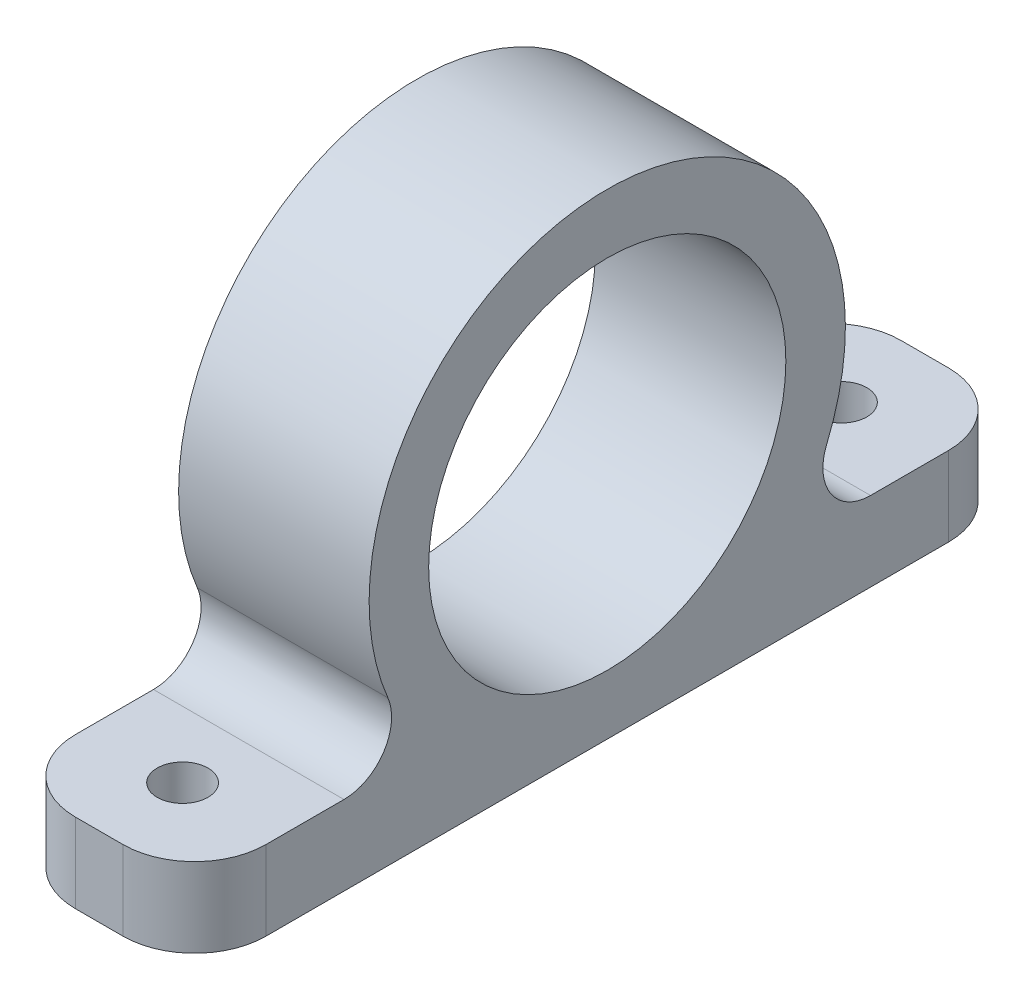
ISO-10303-21;
HEADER;
FILE_DESCRIPTION(('STEP AP214'),'2;1');
FILE_NAME('part.step','',(''),(''),'','','');
FILE_SCHEMA(('AUTOMOTIVE_DESIGN { 1 0 10303 214 1 1 1 1 }'));
ENDSEC;
DATA;
#1=APPLICATION_CONTEXT('core data for automotive mechanical design processes');
#2=APPLICATION_PROTOCOL_DEFINITION('international standard','automotive_design',2000,#1);
#3=PRODUCT_CONTEXT('',#1,'mechanical');
#4=PRODUCT('Part','Part','',(#3));
#5=PRODUCT_RELATED_PRODUCT_CATEGORY('part','',(#4));
#6=PRODUCT_DEFINITION_FORMATION('','',#4);
#7=PRODUCT_DEFINITION_CONTEXT('part definition',#1,'design');
#8=PRODUCT_DEFINITION('design','',#6,#7);
#9=PRODUCT_DEFINITION_SHAPE('','',#8);
#10=(LENGTH_UNIT() NAMED_UNIT(*) SI_UNIT(.MILLI.,.METRE.));
#11=(NAMED_UNIT(*) PLANE_ANGLE_UNIT() SI_UNIT($,.RADIAN.));
#12=(NAMED_UNIT(*) SI_UNIT($,.STERADIAN.) SOLID_ANGLE_UNIT());
#13=UNCERTAINTY_MEASURE_WITH_UNIT(LENGTH_MEASURE(1.E-05),#10,'distance_accuracy_value','');
#14=(GEOMETRIC_REPRESENTATION_CONTEXT(3) GLOBAL_UNCERTAINTY_ASSIGNED_CONTEXT((#13)) GLOBAL_UNIT_ASSIGNED_CONTEXT((#10,
#11,#12)) REPRESENTATION_CONTEXT('',''));
#15=CARTESIAN_POINT('',(0.,0.,0.));
#16=DIRECTION('',(0.,0.,1.));
#17=DIRECTION('',(1.,0.,0.));
#18=AXIS2_PLACEMENT_3D('',#15,#16,#17);
#19=CARTESIAN_POINT('',(12.,-15.,26.));
#20=DIRECTION('',(0.,0.,-1.));
#21=DIRECTION('',(-1.,0.,0.));
#22=AXIS2_PLACEMENT_3D('',#19,#20,#21);
#23=PLANE('',#22);
#24=DIRECTION('',(-1.,0.,0.));
#25=VECTOR('',#24,1.);
#26=CARTESIAN_POINT('',(12.,-10.,26.));
#27=LINE('',#26,#25);
#28=CARTESIAN_POINT('',(7.5,-10.,26.));
#29=VERTEX_POINT('',#28);
#30=CARTESIAN_POINT('',(4.5,-10.,26.));
#31=VERTEX_POINT('',#30);
#32=EDGE_CURVE('E172',#29,#31,#27,.T.);
#33=ORIENTED_EDGE('',*,*,#32,.T.);
#34=DIRECTION('',(0.,-1.,0.));
#35=VECTOR('',#34,1.);
#36=CARTESIAN_POINT('',(4.5,-15.,26.));
#37=LINE('',#36,#35);
#38=CARTESIAN_POINT('',(4.5,-15.,26.));
#39=VERTEX_POINT('',#38);
#40=EDGE_CURVE('E243',#31,#39,#37,.T.);
#41=ORIENTED_EDGE('',*,*,#40,.T.);
#42=DIRECTION('',(-1.,0.,0.));
#43=VECTOR('',#42,1.);
#44=CARTESIAN_POINT('',(12.,-15.,26.));
#45=LINE('',#44,#43);
#46=CARTESIAN_POINT('',(7.5,-15.,26.));
#47=VERTEX_POINT('',#46);
#48=EDGE_CURVE('E152',#47,#39,#45,.T.);
#49=ORIENTED_EDGE('',*,*,#48,.F.);
#50=DIRECTION('',(0.,-1.,0.));
#51=VECTOR('',#50,1.);
#52=CARTESIAN_POINT('',(7.5,-10.,26.));
#53=LINE('',#52,#51);
#54=EDGE_CURVE('E62',#47,#29,#53,.F.);
#55=ORIENTED_EDGE('',*,*,#54,.T.);
#56=EDGE_LOOP('',(#33,#41,#49,#55));
#57=FACE_BOUND('',#56,.T.);
#58=ADVANCED_FACE('F39',(#57),#23,.F.);
#59=CARTESIAN_POINT('',(12.,-15.,26.));
#60=DIRECTION('',(0.,1.,0.));
#61=DIRECTION('',(0.,0.,1.));
#62=AXIS2_PLACEMENT_3D('',#59,#60,#61);
#63=PLANE('',#62);
#64=CARTESIAN_POINT('',(6.,-15.,20.75));
#65=DIRECTION('',(0.,1.,0.));
#66=DIRECTION('',(0.,0.,-1.));
#67=AXIS2_PLACEMENT_3D('',#64,#65,#66);
#68=CIRCLE('',#67,1.6);
#69=CARTESIAN_POINT('',(6.,-15.,19.15));
#70=VERTEX_POINT('',#69);
#71=EDGE_CURVE('E266',#70,#70,#68,.T.);
#72=ORIENTED_EDGE('',*,*,#71,.T.);
#73=EDGE_LOOP('',(#72));
#74=FACE_BOUND('',#73,.T.);
#75=CARTESIAN_POINT('',(6.,-15.,-20.75));
#76=DIRECTION('',(0.,1.,0.));
#77=DIRECTION('',(0.,0.,1.));
#78=AXIS2_PLACEMENT_3D('',#75,#76,#77);
#79=CIRCLE('',#78,1.6);
#80=CARTESIAN_POINT('',(6.,-15.,-19.15));
#81=VERTEX_POINT('',#80);
#82=EDGE_CURVE('E252',#81,#81,#79,.T.);
#83=ORIENTED_EDGE('',*,*,#82,.T.);
#84=EDGE_LOOP('',(#83));
#85=FACE_BOUND('',#84,.T.);
#86=DIRECTION('',(-1.,0.,0.));
#87=VECTOR('',#86,1.);
#88=CARTESIAN_POINT('',(12.,-15.,-26.));
#89=LINE('',#88,#87);
#90=CARTESIAN_POINT('',(7.5,-15.,-26.));
#91=VERTEX_POINT('',#90);
#92=CARTESIAN_POINT('',(4.5,-15.,-26.));
#93=VERTEX_POINT('',#92);
#94=EDGE_CURVE('E179',#91,#93,#89,.T.);
#95=ORIENTED_EDGE('',*,*,#94,.F.);
#96=CARTESIAN_POINT('',(7.5,-15.,-21.5));
#97=DIRECTION('',(0.,1.,0.));
#98=DIRECTION('',(0.,0.,1.));
#99=AXIS2_PLACEMENT_3D('',#96,#97,#98);
#100=CIRCLE('',#99,4.5);
#101=CARTESIAN_POINT('',(12.,-15.,-21.5));
#102=VERTEX_POINT('',#101);
#103=EDGE_CURVE('E233',#91,#102,#100,.F.);
#104=ORIENTED_EDGE('',*,*,#103,.T.);
#105=DIRECTION('',(0.,0.,-1.));
#106=VECTOR('',#105,1.);
#107=CARTESIAN_POINT('',(12.,-15.,26.));
#108=LINE('',#107,#106);
#109=CARTESIAN_POINT('',(12.,-15.,21.5));
#110=VERTEX_POINT('',#109);
#111=EDGE_CURVE('E160',#110,#102,#108,.T.);
#112=ORIENTED_EDGE('',*,*,#111,.F.);
#113=CARTESIAN_POINT('',(7.5,-15.,21.5));
#114=DIRECTION('',(0.,1.,0.));
#115=DIRECTION('',(0.,0.,1.));
#116=AXIS2_PLACEMENT_3D('',#113,#114,#115);
#117=CIRCLE('',#116,4.5);
#118=EDGE_CURVE('E224',#110,#47,#117,.F.);
#119=ORIENTED_EDGE('',*,*,#118,.T.);
#120=ORIENTED_EDGE('',*,*,#48,.T.);
#121=CARTESIAN_POINT('',(4.5,-15.,21.5));
#122=DIRECTION('',(0.,1.,0.));
#123=DIRECTION('',(0.,0.,1.));
#124=AXIS2_PLACEMENT_3D('',#121,#122,#123);
#125=CIRCLE('',#124,4.5);
#126=CARTESIAN_POINT('',(0.,-15.,21.5));
#127=VERTEX_POINT('',#126);
#128=EDGE_CURVE('E227',#39,#127,#125,.F.);
#129=ORIENTED_EDGE('',*,*,#128,.T.);
#130=DIRECTION('',(0.,0.,-1.));
#131=VECTOR('',#130,1.);
#132=CARTESIAN_POINT('',(0.,-15.,26.));
#133=LINE('',#132,#131);
#134=CARTESIAN_POINT('',(0.,-15.,-21.5));
#135=VERTEX_POINT('',#134);
#136=EDGE_CURVE('E271',#127,#135,#133,.T.);
#137=ORIENTED_EDGE('',*,*,#136,.T.);
#138=CARTESIAN_POINT('',(4.5,-15.,-21.5));
#139=DIRECTION('',(0.,1.,0.));
#140=DIRECTION('',(0.,0.,1.));
#141=AXIS2_PLACEMENT_3D('',#138,#139,#140);
#142=CIRCLE('',#141,4.5);
#143=EDGE_CURVE('E230',#135,#93,#142,.F.);
#144=ORIENTED_EDGE('',*,*,#143,.T.);
#145=EDGE_LOOP('',(#95,#104,#112,#119,#120,#129,#137,#144));
#146=FACE_BOUND('',#145,.T.);
#147=ADVANCED_FACE('F310',(#74,#85,#146),#63,.F.);
#148=CARTESIAN_POINT('',(12.,-15.,-26.));
#149=DIRECTION('',(0.,0.,1.));
#150=DIRECTION('',(1.,0.,0.));
#151=AXIS2_PLACEMENT_3D('',#148,#149,#150);
#152=PLANE('',#151);
#153=DIRECTION('',(-1.,0.,0.));
#154=VECTOR('',#153,1.);
#155=CARTESIAN_POINT('',(12.,-9.99999999999999,-26.));
#156=LINE('',#155,#154);
#157=CARTESIAN_POINT('',(7.5,-9.99999999999999,-26.));
#158=VERTEX_POINT('',#157);
#159=CARTESIAN_POINT('',(4.5,-9.99999999999999,-26.));
#160=VERTEX_POINT('',#159);
#161=EDGE_CURVE('E175',#158,#160,#156,.T.);
#162=ORIENTED_EDGE('',*,*,#161,.F.);
#163=DIRECTION('',(0.,1.,0.));
#164=VECTOR('',#163,1.);
#165=CARTESIAN_POINT('',(7.5,-15.,-26.));
#166=LINE('',#165,#164);
#167=EDGE_CURVE('E221',#158,#91,#166,.F.);
#168=ORIENTED_EDGE('',*,*,#167,.T.);
#169=ORIENTED_EDGE('',*,*,#94,.T.);
#170=DIRECTION('',(0.,1.,0.));
#171=VECTOR('',#170,1.);
#172=CARTESIAN_POINT('',(4.5,-15.,-26.));
#173=LINE('',#172,#171);
#174=EDGE_CURVE('E217',#93,#160,#173,.T.);
#175=ORIENTED_EDGE('',*,*,#174,.T.);
#176=EDGE_LOOP('',(#162,#168,#169,#175));
#177=FACE_BOUND('',#176,.T.);
#178=ADVANCED_FACE('F306',(#177),#152,.F.);
#179=CARTESIAN_POINT('',(12.,-9.99999999999999,-26.));
#180=DIRECTION('',(0.,-1.,0.));
#181=DIRECTION('',(0.,0.,-1.));
#182=AXIS2_PLACEMENT_3D('',#179,#180,#181);
#183=PLANE('',#182);
#184=CARTESIAN_POINT('',(6.,-9.99999999999999,-20.75));
#185=DIRECTION('',(0.,-1.,0.));
#186=DIRECTION('',(0.,0.,-1.));
#187=AXIS2_PLACEMENT_3D('',#184,#185,#186);
#188=CIRCLE('',#187,1.6);
#189=CARTESIAN_POINT('',(6.,-9.99999999999999,-22.35));
#190=VERTEX_POINT('',#189);
#191=EDGE_CURVE('E248',#190,#190,#188,.F.);
#192=ORIENTED_EDGE('',*,*,#191,.F.);
#193=EDGE_LOOP('',(#192));
#194=FACE_BOUND('',#193,.T.);
#195=DIRECTION('',(0.,0.,1.));
#196=VECTOR('',#195,1.);
#197=CARTESIAN_POINT('',(12.,-9.99999999999999,-26.));
#198=LINE('',#197,#196);
#199=CARTESIAN_POINT('',(12.,-9.99999999999999,-21.5));
#200=VERTEX_POINT('',#199);
#201=CARTESIAN_POINT('',(12.,-9.99999999999999,-16.583123951777));
#202=VERTEX_POINT('',#201);
#203=EDGE_CURVE('E166',#200,#202,#198,.T.);
#204=ORIENTED_EDGE('',*,*,#203,.F.);
#205=CARTESIAN_POINT('',(7.5,-9.99999999999999,-21.5));
#206=DIRECTION('',(0.,-1.,0.));
#207=DIRECTION('',(0.,0.,-1.));
#208=AXIS2_PLACEMENT_3D('',#205,#206,#207);
#209=CIRCLE('',#208,4.5);
#210=EDGE_CURVE('E214',#200,#158,#209,.F.);
#211=ORIENTED_EDGE('',*,*,#210,.T.);
#212=ORIENTED_EDGE('',*,*,#161,.T.);
#213=CARTESIAN_POINT('',(4.5,-9.99999999999999,-21.5));
#214=DIRECTION('',(0.,-1.,0.));
#215=DIRECTION('',(0.,0.,-1.));
#216=AXIS2_PLACEMENT_3D('',#213,#214,#215);
#217=CIRCLE('',#216,4.5);
#218=CARTESIAN_POINT('',(0.,-9.99999999999999,-21.5));
#219=VERTEX_POINT('',#218);
#220=EDGE_CURVE('E211',#160,#219,#217,.F.);
#221=ORIENTED_EDGE('',*,*,#220,.T.);
#222=DIRECTION('',(0.,0.,1.));
#223=VECTOR('',#222,1.);
#224=CARTESIAN_POINT('',(0.,-9.99999999999999,-26.));
#225=LINE('',#224,#223);
#226=CARTESIAN_POINT('',(0.,-9.99999999999999,-16.583123951777));
#227=VERTEX_POINT('',#226);
#228=EDGE_CURVE('E168',#219,#227,#225,.T.);
#229=ORIENTED_EDGE('',*,*,#228,.T.);
#230=DIRECTION('',(1.,0.,0.));
#231=VECTOR('',#230,1.);
#232=CARTESIAN_POINT('',(12.,-9.99999999999999,-16.583123951777));
#233=LINE('',#232,#231);
#234=EDGE_CURVE('E143',#227,#202,#233,.T.);
#235=ORIENTED_EDGE('',*,*,#234,.T.);
#236=EDGE_LOOP('',(#204,#211,#212,#221,#229,#235));
#237=FACE_BOUND('',#236,.T.);
#238=ADVANCED_FACE('F286',(#194,#237),#183,.F.);
#239=CARTESIAN_POINT('',(12.,0.,0.));
#240=DIRECTION('',(-1.,0.,0.));
#241=DIRECTION('',(0.,0.,1.));
#242=AXIS2_PLACEMENT_3D('',#239,#240,#241);
#243=CYLINDRICAL_SURFACE('',#242,15.);
#244=CARTESIAN_POINT('',(0.,0.,0.));
#245=DIRECTION('',(1.,0.,0.));
#246=DIRECTION('',(0.,0.,-1.));
#247=AXIS2_PLACEMENT_3D('',#244,#245,#246);
#248=CIRCLE('',#247,15.);
#249=CARTESIAN_POINT('',(0.,-5.83333333333333,-13.8192699598142));
#250=VERTEX_POINT('',#249);
#251=CARTESIAN_POINT('',(0.,-5.83333333333333,13.8192699598142));
#252=VERTEX_POINT('',#251);
#253=EDGE_CURVE('E161',#250,#252,#248,.T.);
#254=ORIENTED_EDGE('',*,*,#253,.T.);
#255=DIRECTION('',(-1.,0.,0.));
#256=VECTOR('',#255,1.);
#257=CARTESIAN_POINT('',(12.,-5.83333333333333,13.8192699598142));
#258=LINE('',#257,#256);
#259=CARTESIAN_POINT('',(12.,-5.83333333333333,13.8192699598142));
#260=VERTEX_POINT('',#259);
#261=EDGE_CURVE('E136',#252,#260,#258,.F.);
#262=ORIENTED_EDGE('',*,*,#261,.T.);
#263=CARTESIAN_POINT('',(12.,0.,0.));
#264=DIRECTION('',(1.,0.,0.));
#265=DIRECTION('',(0.,0.,-1.));
#266=AXIS2_PLACEMENT_3D('',#263,#264,#265);
#267=CIRCLE('',#266,15.);
#268=CARTESIAN_POINT('',(12.,-5.83333333333333,-13.8192699598142));
#269=VERTEX_POINT('',#268);
#270=EDGE_CURVE('E275',#269,#260,#267,.T.);
#271=ORIENTED_EDGE('',*,*,#270,.F.);
#272=DIRECTION('',(-1.,0.,0.));
#273=VECTOR('',#272,1.);
#274=CARTESIAN_POINT('',(12.,-5.83333333333333,-13.8192699598142));
#275=LINE('',#274,#273);
#276=EDGE_CURVE('E151',#269,#250,#275,.T.);
#277=ORIENTED_EDGE('',*,*,#276,.T.);
#278=EDGE_LOOP('',(#254,#262,#271,#277));
#279=FACE_BOUND('',#278,.T.);
#280=ADVANCED_FACE('F297',(#279),#243,.T.);
#281=CARTESIAN_POINT('',(12.,-10.,26.));
#282=DIRECTION('',(0.,-1.,0.));
#283=DIRECTION('',(0.,0.,-1.));
#284=AXIS2_PLACEMENT_3D('',#281,#282,#283);
#285=PLANE('',#284);
#286=CARTESIAN_POINT('',(6.,-10.,20.75));
#287=DIRECTION('',(0.,-1.,0.));
#288=DIRECTION('',(0.,0.,-1.));
#289=AXIS2_PLACEMENT_3D('',#286,#287,#288);
#290=CIRCLE('',#289,1.6);
#291=CARTESIAN_POINT('',(6.,-10.,19.15));
#292=VERTEX_POINT('',#291);
#293=EDGE_CURVE('E43',#292,#292,#290,.F.);
#294=ORIENTED_EDGE('',*,*,#293,.F.);
#295=EDGE_LOOP('',(#294));
#296=FACE_BOUND('',#295,.T.);
#297=DIRECTION('',(0.,0.,1.));
#298=VECTOR('',#297,1.);
#299=CARTESIAN_POINT('',(0.,-10.,26.));
#300=LINE('',#299,#298);
#301=CARTESIAN_POINT('',(0.,-10.,16.583123951777));
#302=VERTEX_POINT('',#301);
#303=CARTESIAN_POINT('',(0.,-10.,21.5));
#304=VERTEX_POINT('',#303);
#305=EDGE_CURVE('E147',#302,#304,#300,.T.);
#306=ORIENTED_EDGE('',*,*,#305,.T.);
#307=CARTESIAN_POINT('',(4.5,-10.,21.5));
#308=DIRECTION('',(0.,-1.,0.));
#309=DIRECTION('',(0.,0.,-1.));
#310=AXIS2_PLACEMENT_3D('',#307,#308,#309);
#311=CIRCLE('',#310,4.5);
#312=EDGE_CURVE('E11',#304,#31,#311,.F.);
#313=ORIENTED_EDGE('',*,*,#312,.T.);
#314=ORIENTED_EDGE('',*,*,#32,.F.);
#315=CARTESIAN_POINT('',(7.5,-10.,21.5));
#316=DIRECTION('',(0.,-1.,0.));
#317=DIRECTION('',(0.,0.,-1.));
#318=AXIS2_PLACEMENT_3D('',#315,#316,#317);
#319=CIRCLE('',#318,4.5);
#320=CARTESIAN_POINT('',(12.,-10.,21.5));
#321=VERTEX_POINT('',#320);
#322=EDGE_CURVE('E49',#29,#321,#319,.F.);
#323=ORIENTED_EDGE('',*,*,#322,.T.);
#324=DIRECTION('',(0.,0.,1.));
#325=VECTOR('',#324,1.);
#326=CARTESIAN_POINT('',(12.,-10.,26.));
#327=LINE('',#326,#325);
#328=CARTESIAN_POINT('',(12.,-10.,16.583123951777));
#329=VERTEX_POINT('',#328);
#330=EDGE_CURVE('E149',#329,#321,#327,.T.);
#331=ORIENTED_EDGE('',*,*,#330,.F.);
#332=DIRECTION('',(1.,0.,0.));
#333=VECTOR('',#332,1.);
#334=CARTESIAN_POINT('',(0.,-10.,16.583123951777));
#335=LINE('',#334,#333);
#336=EDGE_CURVE('E135',#329,#302,#335,.F.);
#337=ORIENTED_EDGE('',*,*,#336,.T.);
#338=EDGE_LOOP('',(#306,#313,#314,#323,#331,#337));
#339=FACE_BOUND('',#338,.T.);
#340=ADVANCED_FACE('F146',(#296,#339),#285,.F.);
#341=CARTESIAN_POINT('',(12.,0.,0.));
#342=DIRECTION('',(1.,0.,0.));
#343=DIRECTION('',(0.,0.,-1.));
#344=AXIS2_PLACEMENT_3D('',#341,#342,#343);
#345=PLANE('',#344);
#346=CARTESIAN_POINT('',(12.,0.,0.));
#347=DIRECTION('',(-1.,0.,0.));
#348=DIRECTION('',(0.,0.,1.));
#349=AXIS2_PLACEMENT_3D('',#346,#347,#348);
#350=CIRCLE('',#349,11.25);
#351=CARTESIAN_POINT('',(12.,0.,11.25));
#352=VERTEX_POINT('',#351);
#353=EDGE_CURVE('E258',#352,#352,#350,.T.);
#354=ORIENTED_EDGE('',*,*,#353,.T.);
#355=EDGE_LOOP('',(#354));
#356=FACE_BOUND('',#355,.T.);
#357=ORIENTED_EDGE('',*,*,#111,.T.);
#358=DIRECTION('',(0.,1.,0.));
#359=VECTOR('',#358,1.);
#360=CARTESIAN_POINT('',(12.,-9.99999999999999,-21.5));
#361=LINE('',#360,#359);
#362=EDGE_CURVE('E207',#102,#200,#361,.T.);
#363=ORIENTED_EDGE('',*,*,#362,.T.);
#364=ORIENTED_EDGE('',*,*,#203,.T.);
#365=CARTESIAN_POINT('',(12.,-6.99999999999999,-16.583123951777));
#366=DIRECTION('',(1.,0.,0.));
#367=DIRECTION('',(0.,0.,-1.));
#368=AXIS2_PLACEMENT_3D('',#365,#366,#367);
#369=CIRCLE('',#368,3.);
#370=EDGE_CURVE('E200',#202,#269,#369,.F.);
#371=ORIENTED_EDGE('',*,*,#370,.T.);
#372=ORIENTED_EDGE('',*,*,#270,.T.);
#373=CARTESIAN_POINT('',(12.,-7.,16.583123951777));
#374=DIRECTION('',(1.,0.,0.));
#375=DIRECTION('',(0.,0.,-1.));
#376=AXIS2_PLACEMENT_3D('',#373,#374,#375);
#377=CIRCLE('',#376,3.);
#378=EDGE_CURVE('E142',#260,#329,#377,.F.);
#379=ORIENTED_EDGE('',*,*,#378,.T.);
#380=ORIENTED_EDGE('',*,*,#330,.T.);
#381=DIRECTION('',(0.,-1.,0.));
#382=VECTOR('',#381,1.);
#383=CARTESIAN_POINT('',(12.,-15.,21.5));
#384=LINE('',#383,#382);
#385=EDGE_CURVE('E203',#321,#110,#384,.T.);
#386=ORIENTED_EDGE('',*,*,#385,.T.);
#387=EDGE_LOOP('',(#357,#363,#364,#371,#372,#379,#380,#386));
#388=FACE_BOUND('',#387,.T.);
#389=ADVANCED_FACE('F295',(#356,#388),#345,.T.);
#390=CARTESIAN_POINT('',(0.,0.,0.));
#391=DIRECTION('',(1.,0.,0.));
#392=DIRECTION('',(0.,0.,-1.));
#393=AXIS2_PLACEMENT_3D('',#390,#391,#392);
#394=PLANE('',#393);
#395=CARTESIAN_POINT('',(0.,0.,0.));
#396=DIRECTION('',(-1.,0.,0.));
#397=DIRECTION('',(0.,0.,1.));
#398=AXIS2_PLACEMENT_3D('',#395,#396,#397);
#399=CIRCLE('',#398,11.25);
#400=CARTESIAN_POINT('',(0.,0.,11.25));
#401=VERTEX_POINT('',#400);
#402=EDGE_CURVE('E251',#401,#401,#399,.T.);
#403=ORIENTED_EDGE('',*,*,#402,.F.);
#404=EDGE_LOOP('',(#403));
#405=FACE_BOUND('',#404,.T.);
#406=ORIENTED_EDGE('',*,*,#228,.F.);
#407=DIRECTION('',(0.,1.,0.));
#408=VECTOR('',#407,1.);
#409=CARTESIAN_POINT('',(0.,0.,-21.5));
#410=LINE('',#409,#408);
#411=EDGE_CURVE('E238',#219,#135,#410,.F.);
#412=ORIENTED_EDGE('',*,*,#411,.T.);
#413=ORIENTED_EDGE('',*,*,#136,.F.);
#414=DIRECTION('',(0.,-1.,0.));
#415=VECTOR('',#414,1.);
#416=CARTESIAN_POINT('',(0.,0.,21.5));
#417=LINE('',#416,#415);
#418=EDGE_CURVE('E158',#127,#304,#417,.F.);
#419=ORIENTED_EDGE('',*,*,#418,.T.);
#420=ORIENTED_EDGE('',*,*,#305,.F.);
#421=CARTESIAN_POINT('',(0.,-7.,16.583123951777));
#422=DIRECTION('',(1.,0.,0.));
#423=DIRECTION('',(0.,0.,-1.));
#424=AXIS2_PLACEMENT_3D('',#421,#422,#423);
#425=CIRCLE('',#424,3.);
#426=EDGE_CURVE('E131',#302,#252,#425,.T.);
#427=ORIENTED_EDGE('',*,*,#426,.T.);
#428=ORIENTED_EDGE('',*,*,#253,.F.);
#429=CARTESIAN_POINT('',(0.,-6.99999999999999,-16.583123951777));
#430=DIRECTION('',(1.,0.,0.));
#431=DIRECTION('',(0.,0.,-1.));
#432=AXIS2_PLACEMENT_3D('',#429,#430,#431);
#433=CIRCLE('',#432,3.);
#434=EDGE_CURVE('E196',#250,#227,#433,.T.);
#435=ORIENTED_EDGE('',*,*,#434,.T.);
#436=EDGE_LOOP('',(#406,#412,#413,#419,#420,#427,#428,#435));
#437=FACE_BOUND('',#436,.T.);
#438=ADVANCED_FACE('F155',(#405,#437),#394,.F.);
#439=CARTESIAN_POINT('',(12.,0.,0.));
#440=DIRECTION('',(-1.,0.,0.));
#441=DIRECTION('',(0.,0.,1.));
#442=AXIS2_PLACEMENT_3D('',#439,#440,#441);
#443=CYLINDRICAL_SURFACE('',#442,11.25);
#444=ORIENTED_EDGE('',*,*,#353,.F.);
#445=EDGE_LOOP('',(#444));
#446=FACE_BOUND('',#445,.T.);
#447=ORIENTED_EDGE('',*,*,#402,.T.);
#448=EDGE_LOOP('',(#447));
#449=FACE_BOUND('',#448,.T.);
#450=ADVANCED_FACE('F321',(#446,#449),#443,.F.);
#451=CARTESIAN_POINT('',(12.,-7.,16.583123951777));
#452=DIRECTION('',(-1.,0.,0.));
#453=DIRECTION('',(0.,0.,1.));
#454=AXIS2_PLACEMENT_3D('',#451,#452,#453);
#455=CYLINDRICAL_SURFACE('',#454,3.);
#456=ORIENTED_EDGE('',*,*,#378,.F.);
#457=ORIENTED_EDGE('',*,*,#261,.F.);
#458=ORIENTED_EDGE('',*,*,#426,.F.);
#459=ORIENTED_EDGE('',*,*,#336,.F.);
#460=EDGE_LOOP('',(#456,#457,#458,#459));
#461=FACE_BOUND('',#460,.T.);
#462=ADVANCED_FACE('F134',(#461),#455,.F.);
#463=CARTESIAN_POINT('',(12.,-6.99999999999999,-16.583123951777));
#464=DIRECTION('',(-1.,0.,0.));
#465=DIRECTION('',(0.,0.,1.));
#466=AXIS2_PLACEMENT_3D('',#463,#464,#465);
#467=CYLINDRICAL_SURFACE('',#466,3.);
#468=ORIENTED_EDGE('',*,*,#370,.F.);
#469=ORIENTED_EDGE('',*,*,#234,.F.);
#470=ORIENTED_EDGE('',*,*,#434,.F.);
#471=ORIENTED_EDGE('',*,*,#276,.F.);
#472=EDGE_LOOP('',(#468,#469,#470,#471));
#473=FACE_BOUND('',#472,.T.);
#474=ADVANCED_FACE('F292',(#473),#467,.F.);
#475=CARTESIAN_POINT('',(7.5,0.,-21.5));
#476=DIRECTION('',(0.,-1.,0.));
#477=DIRECTION('',(0.,0.,-1.));
#478=AXIS2_PLACEMENT_3D('',#475,#476,#477);
#479=CYLINDRICAL_SURFACE('',#478,4.5);
#480=ORIENTED_EDGE('',*,*,#103,.F.);
#481=ORIENTED_EDGE('',*,*,#167,.F.);
#482=ORIENTED_EDGE('',*,*,#210,.F.);
#483=ORIENTED_EDGE('',*,*,#362,.F.);
#484=EDGE_LOOP('',(#480,#481,#482,#483));
#485=FACE_BOUND('',#484,.T.);
#486=ADVANCED_FACE('F324',(#485),#479,.T.);
#487=CARTESIAN_POINT('',(4.5,-15.,-21.5));
#488=DIRECTION('',(0.,1.,0.));
#489=DIRECTION('',(0.,0.,1.));
#490=AXIS2_PLACEMENT_3D('',#487,#488,#489);
#491=CYLINDRICAL_SURFACE('',#490,4.5);
#492=ORIENTED_EDGE('',*,*,#143,.F.);
#493=ORIENTED_EDGE('',*,*,#411,.F.);
#494=ORIENTED_EDGE('',*,*,#220,.F.);
#495=ORIENTED_EDGE('',*,*,#174,.F.);
#496=EDGE_LOOP('',(#492,#493,#494,#495));
#497=FACE_BOUND('',#496,.T.);
#498=ADVANCED_FACE('F327',(#497),#491,.T.);
#499=CARTESIAN_POINT('',(4.5,-15.,21.5));
#500=DIRECTION('',(0.,-1.,0.));
#501=DIRECTION('',(0.,0.,-1.));
#502=AXIS2_PLACEMENT_3D('',#499,#500,#501);
#503=CYLINDRICAL_SURFACE('',#502,4.5);
#504=ORIENTED_EDGE('',*,*,#312,.F.);
#505=ORIENTED_EDGE('',*,*,#418,.F.);
#506=ORIENTED_EDGE('',*,*,#128,.F.);
#507=ORIENTED_EDGE('',*,*,#40,.F.);
#508=EDGE_LOOP('',(#504,#505,#506,#507));
#509=FACE_BOUND('',#508,.T.);
#510=ADVANCED_FACE('F330',(#509),#503,.T.);
#511=CARTESIAN_POINT('',(7.5,0.,21.5));
#512=DIRECTION('',(0.,1.,0.));
#513=DIRECTION('',(0.,0.,1.));
#514=AXIS2_PLACEMENT_3D('',#511,#512,#513);
#515=CYLINDRICAL_SURFACE('',#514,4.5);
#516=ORIENTED_EDGE('',*,*,#322,.F.);
#517=ORIENTED_EDGE('',*,*,#54,.F.);
#518=ORIENTED_EDGE('',*,*,#118,.F.);
#519=ORIENTED_EDGE('',*,*,#385,.F.);
#520=EDGE_LOOP('',(#516,#517,#518,#519));
#521=FACE_BOUND('',#520,.T.);
#522=ADVANCED_FACE('F41',(#521),#515,.T.);
#523=CARTESIAN_POINT('',(6.,0.,-20.75));
#524=DIRECTION('',(0.,-1.,0.));
#525=DIRECTION('',(0.,0.,-1.));
#526=AXIS2_PLACEMENT_3D('',#523,#524,#525);
#527=CYLINDRICAL_SURFACE('',#526,1.6);
#528=ORIENTED_EDGE('',*,*,#82,.F.);
#529=EDGE_LOOP('',(#528));
#530=FACE_BOUND('',#529,.T.);
#531=ORIENTED_EDGE('',*,*,#191,.T.);
#532=EDGE_LOOP('',(#531));
#533=FACE_BOUND('',#532,.T.);
#534=ADVANCED_FACE('F337',(#530,#533),#527,.F.);
#535=CARTESIAN_POINT('',(6.,0.,20.75));
#536=DIRECTION('',(0.,-1.,0.));
#537=DIRECTION('',(0.,0.,-1.));
#538=AXIS2_PLACEMENT_3D('',#535,#536,#537);
#539=CYLINDRICAL_SURFACE('',#538,1.6);
#540=ORIENTED_EDGE('',*,*,#71,.F.);
#541=EDGE_LOOP('',(#540));
#542=FACE_BOUND('',#541,.T.);
#543=ORIENTED_EDGE('',*,*,#293,.T.);
#544=EDGE_LOOP('',(#543));
#545=FACE_BOUND('',#544,.T.);
#546=ADVANCED_FACE('F383',(#542,#545),#539,.F.);
#547=CLOSED_SHELL('',(#58,#147,#178,#238,#280,#340,#389,#438,#450,#462,#474,#486,#498,#510,#522,
#534,#546));
#548=MANIFOLD_SOLID_BREP('B2',#547);
#549=ADVANCED_BREP_SHAPE_REPRESENTATION('',(#18,#548),#14);
#550=SHAPE_DEFINITION_REPRESENTATION(#9,#549);
ENDSEC;
END-ISO-10303-21;
